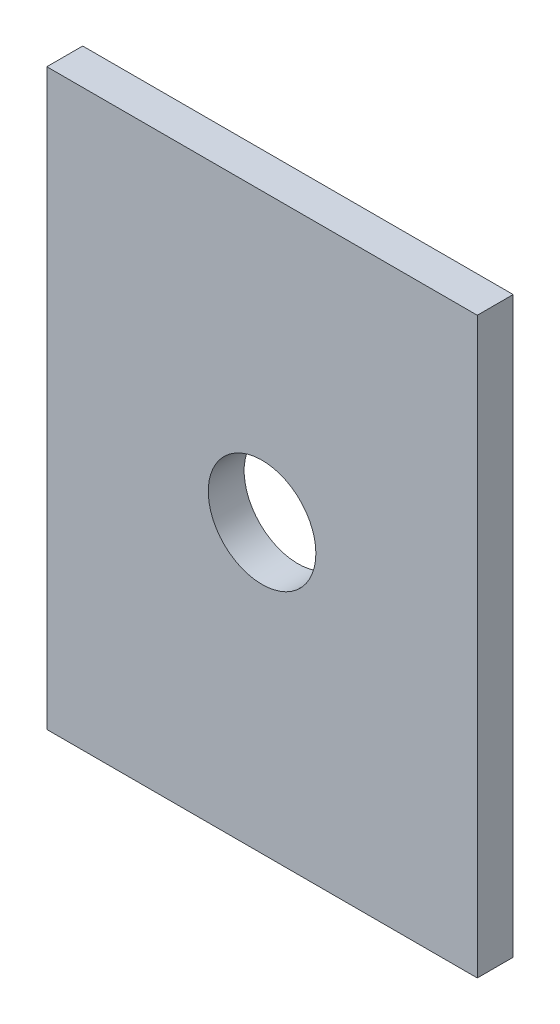
ISO-10303-21;
HEADER;
FILE_DESCRIPTION(('STEP AP214'),'2;1');
FILE_NAME('part.step','',(''),(''),'','','');
FILE_SCHEMA(('AUTOMOTIVE_DESIGN { 1 0 10303 214 1 1 1 1 }'));
ENDSEC;
DATA;
#1=APPLICATION_CONTEXT('core data for automotive mechanical design processes');
#2=APPLICATION_PROTOCOL_DEFINITION('international standard','automotive_design',2000,#1);
#3=PRODUCT_CONTEXT('',#1,'mechanical');
#4=PRODUCT('Part','Part','',(#3));
#5=PRODUCT_RELATED_PRODUCT_CATEGORY('part','',(#4));
#6=PRODUCT_DEFINITION_FORMATION('','',#4);
#7=PRODUCT_DEFINITION_CONTEXT('part definition',#1,'design');
#8=PRODUCT_DEFINITION('design','',#6,#7);
#9=PRODUCT_DEFINITION_SHAPE('','',#8);
#10=(LENGTH_UNIT() NAMED_UNIT(*) SI_UNIT(.MILLI.,.METRE.));
#11=(NAMED_UNIT(*) PLANE_ANGLE_UNIT() SI_UNIT($,.RADIAN.));
#12=(NAMED_UNIT(*) SI_UNIT($,.STERADIAN.) SOLID_ANGLE_UNIT());
#13=UNCERTAINTY_MEASURE_WITH_UNIT(LENGTH_MEASURE(1.E-05),#10,'distance_accuracy_value','');
#14=(GEOMETRIC_REPRESENTATION_CONTEXT(3) GLOBAL_UNCERTAINTY_ASSIGNED_CONTEXT((#13)) GLOBAL_UNIT_ASSIGNED_CONTEXT((#10,
#11,#12)) REPRESENTATION_CONTEXT('',''));
#15=CARTESIAN_POINT('',(0.,0.,0.));
#16=DIRECTION('',(0.,0.,1.));
#17=DIRECTION('',(1.,0.,0.));
#18=AXIS2_PLACEMENT_3D('',#15,#16,#17);
#19=CARTESIAN_POINT('',(0.,0.,3.175));
#20=DIRECTION('',(0.,0.,1.));
#21=DIRECTION('',(1.,0.,0.));
#22=AXIS2_PLACEMENT_3D('',#19,#20,#21);
#23=PLANE('',#22);
#24=DIRECTION('',(0.,1.,0.));
#25=VECTOR('',#24,1.);
#26=CARTESIAN_POINT('',(19.05,25.4,3.175));
#27=LINE('',#26,#25);
#28=CARTESIAN_POINT('',(19.05,-25.4,3.175));
#29=VERTEX_POINT('',#28);
#30=CARTESIAN_POINT('',(19.05,25.4,3.175));
#31=VERTEX_POINT('',#30);
#32=EDGE_CURVE('E96',#29,#31,#27,.T.);
#33=ORIENTED_EDGE('',*,*,#32,.T.);
#34=DIRECTION('',(-1.,0.,0.));
#35=VECTOR('',#34,1.);
#36=CARTESIAN_POINT('',(-19.05,25.4,3.175));
#37=LINE('',#36,#35);
#38=CARTESIAN_POINT('',(-19.05,25.4,3.175));
#39=VERTEX_POINT('',#38);
#40=EDGE_CURVE('E91',#31,#39,#37,.T.);
#41=ORIENTED_EDGE('',*,*,#40,.T.);
#42=DIRECTION('',(0.,-1.,0.));
#43=VECTOR('',#42,1.);
#44=CARTESIAN_POINT('',(-19.05,25.4,3.175));
#45=LINE('',#44,#43);
#46=CARTESIAN_POINT('',(-19.05,-25.4,3.175));
#47=VERTEX_POINT('',#46);
#48=EDGE_CURVE('E94',#39,#47,#45,.T.);
#49=ORIENTED_EDGE('',*,*,#48,.T.);
#50=DIRECTION('',(1.,0.,0.));
#51=VECTOR('',#50,1.);
#52=CARTESIAN_POINT('',(-19.05,-25.4,3.175));
#53=LINE('',#52,#51);
#54=EDGE_CURVE('E61',#47,#29,#53,.T.);
#55=ORIENTED_EDGE('',*,*,#54,.T.);
#56=EDGE_LOOP('',(#33,#41,#49,#55));
#57=FACE_BOUND('',#56,.T.);
#58=CARTESIAN_POINT('',(0.,0.,3.175));
#59=DIRECTION('',(0.,0.,1.));
#60=DIRECTION('',(1.,0.,0.));
#61=AXIS2_PLACEMENT_3D('',#58,#59,#60);
#62=CIRCLE('',#61,4.7625);
#63=CARTESIAN_POINT('',(4.7625,0.,3.175));
#64=VERTEX_POINT('',#63);
#65=EDGE_CURVE('E116',#64,#64,#62,.T.);
#66=ORIENTED_EDGE('',*,*,#65,.F.);
#67=EDGE_LOOP('',(#66));
#68=FACE_BOUND('',#67,.T.);
#69=ADVANCED_FACE('F43',(#57,#68),#23,.T.);
#70=CARTESIAN_POINT('',(0.,0.,0.));
#71=DIRECTION('',(0.,0.,1.));
#72=DIRECTION('',(1.,0.,0.));
#73=AXIS2_PLACEMENT_3D('',#70,#71,#72);
#74=PLANE('',#73);
#75=DIRECTION('',(0.,1.,0.));
#76=VECTOR('',#75,1.);
#77=CARTESIAN_POINT('',(19.05,25.4,0.));
#78=LINE('',#77,#76);
#79=CARTESIAN_POINT('',(19.05,-25.4,0.));
#80=VERTEX_POINT('',#79);
#81=CARTESIAN_POINT('',(19.05,25.4,0.));
#82=VERTEX_POINT('',#81);
#83=EDGE_CURVE('E112',#80,#82,#78,.T.);
#84=ORIENTED_EDGE('',*,*,#83,.F.);
#85=DIRECTION('',(1.,0.,0.));
#86=VECTOR('',#85,1.);
#87=CARTESIAN_POINT('',(-19.05,-25.4,0.));
#88=LINE('',#87,#86);
#89=CARTESIAN_POINT('',(-19.05,-25.4,0.));
#90=VERTEX_POINT('',#89);
#91=EDGE_CURVE('E84',#90,#80,#88,.T.);
#92=ORIENTED_EDGE('',*,*,#91,.F.);
#93=DIRECTION('',(0.,-1.,0.));
#94=VECTOR('',#93,1.);
#95=CARTESIAN_POINT('',(-19.05,25.4,0.));
#96=LINE('',#95,#94);
#97=CARTESIAN_POINT('',(-19.05,25.4,0.));
#98=VERTEX_POINT('',#97);
#99=EDGE_CURVE('E78',#98,#90,#96,.T.);
#100=ORIENTED_EDGE('',*,*,#99,.F.);
#101=DIRECTION('',(-1.,0.,0.));
#102=VECTOR('',#101,1.);
#103=CARTESIAN_POINT('',(-19.05,25.4,0.));
#104=LINE('',#103,#102);
#105=EDGE_CURVE('E101',#82,#98,#104,.T.);
#106=ORIENTED_EDGE('',*,*,#105,.F.);
#107=EDGE_LOOP('',(#84,#92,#100,#106));
#108=FACE_BOUND('',#107,.T.);
#109=CARTESIAN_POINT('',(0.,0.,0.));
#110=DIRECTION('',(0.,0.,1.));
#111=DIRECTION('',(1.,0.,0.));
#112=AXIS2_PLACEMENT_3D('',#109,#110,#111);
#113=CIRCLE('',#112,4.7625);
#114=CARTESIAN_POINT('',(4.7625,0.,0.));
#115=VERTEX_POINT('',#114);
#116=EDGE_CURVE('E134',#115,#115,#113,.T.);
#117=ORIENTED_EDGE('',*,*,#116,.T.);
#118=EDGE_LOOP('',(#117));
#119=FACE_BOUND('',#118,.T.);
#120=ADVANCED_FACE('F129',(#108,#119),#74,.F.);
#121=CARTESIAN_POINT('',(19.05,25.4,3.175));
#122=DIRECTION('',(-1.,0.,0.));
#123=DIRECTION('',(0.,-1.,0.));
#124=AXIS2_PLACEMENT_3D('',#121,#122,#123);
#125=PLANE('',#124);
#126=ORIENTED_EDGE('',*,*,#83,.T.);
#127=DIRECTION('',(0.,0.,-1.));
#128=VECTOR('',#127,1.);
#129=CARTESIAN_POINT('',(19.05,25.4,3.175));
#130=LINE('',#129,#128);
#131=EDGE_CURVE('E11',#31,#82,#130,.T.);
#132=ORIENTED_EDGE('',*,*,#131,.F.);
#133=ORIENTED_EDGE('',*,*,#32,.F.);
#134=DIRECTION('',(0.,0.,-1.));
#135=VECTOR('',#134,1.);
#136=CARTESIAN_POINT('',(19.05,-25.4,3.175));
#137=LINE('',#136,#135);
#138=EDGE_CURVE('E108',#29,#80,#137,.T.);
#139=ORIENTED_EDGE('',*,*,#138,.T.);
#140=EDGE_LOOP('',(#126,#132,#133,#139));
#141=FACE_BOUND('',#140,.T.);
#142=ADVANCED_FACE('F45',(#141),#125,.F.);
#143=CARTESIAN_POINT('',(-19.05,25.4,3.175));
#144=DIRECTION('',(0.,-1.,0.));
#145=DIRECTION('',(0.,0.,-1.));
#146=AXIS2_PLACEMENT_3D('',#143,#144,#145);
#147=PLANE('',#146);
#148=ORIENTED_EDGE('',*,*,#105,.T.);
#149=DIRECTION('',(0.,0.,-1.));
#150=VECTOR('',#149,1.);
#151=CARTESIAN_POINT('',(-19.05,25.4,3.175));
#152=LINE('',#151,#150);
#153=EDGE_CURVE('E53',#39,#98,#152,.T.);
#154=ORIENTED_EDGE('',*,*,#153,.F.);
#155=ORIENTED_EDGE('',*,*,#40,.F.);
#156=ORIENTED_EDGE('',*,*,#131,.T.);
#157=EDGE_LOOP('',(#148,#154,#155,#156));
#158=FACE_BOUND('',#157,.T.);
#159=ADVANCED_FACE('F100',(#158),#147,.F.);
#160=CARTESIAN_POINT('',(-19.05,25.4,3.175));
#161=DIRECTION('',(1.,0.,0.));
#162=DIRECTION('',(0.,1.,0.));
#163=AXIS2_PLACEMENT_3D('',#160,#161,#162);
#164=PLANE('',#163);
#165=ORIENTED_EDGE('',*,*,#99,.T.);
#166=DIRECTION('',(0.,0.,-1.));
#167=VECTOR('',#166,1.);
#168=CARTESIAN_POINT('',(-19.05,-25.4,3.175));
#169=LINE('',#168,#167);
#170=EDGE_CURVE('E103',#47,#90,#169,.T.);
#171=ORIENTED_EDGE('',*,*,#170,.F.);
#172=ORIENTED_EDGE('',*,*,#48,.F.);
#173=ORIENTED_EDGE('',*,*,#153,.T.);
#174=EDGE_LOOP('',(#165,#171,#172,#173));
#175=FACE_BOUND('',#174,.T.);
#176=ADVANCED_FACE('F104',(#175),#164,.F.);
#177=CARTESIAN_POINT('',(-19.05,-25.4,3.175));
#178=DIRECTION('',(0.,1.,0.));
#179=DIRECTION('',(0.,0.,1.));
#180=AXIS2_PLACEMENT_3D('',#177,#178,#179);
#181=PLANE('',#180);
#182=ORIENTED_EDGE('',*,*,#91,.T.);
#183=ORIENTED_EDGE('',*,*,#138,.F.);
#184=ORIENTED_EDGE('',*,*,#54,.F.);
#185=ORIENTED_EDGE('',*,*,#170,.T.);
#186=EDGE_LOOP('',(#182,#183,#184,#185));
#187=FACE_BOUND('',#186,.T.);
#188=ADVANCED_FACE('F126',(#187),#181,.F.);
#189=CARTESIAN_POINT('',(0.,0.,3.175));
#190=DIRECTION('',(0.,0.,-1.));
#191=DIRECTION('',(-1.,0.,0.));
#192=AXIS2_PLACEMENT_3D('',#189,#190,#191);
#193=CYLINDRICAL_SURFACE('',#192,4.7625);
#194=ORIENTED_EDGE('',*,*,#65,.T.);
#195=EDGE_LOOP('',(#194));
#196=FACE_BOUND('',#195,.T.);
#197=ORIENTED_EDGE('',*,*,#116,.F.);
#198=EDGE_LOOP('',(#197));
#199=FACE_BOUND('',#198,.T.);
#200=ADVANCED_FACE('F142',(#196,#199),#193,.F.);
#201=CLOSED_SHELL('',(#69,#120,#142,#159,#176,#188,#200));
#202=MANIFOLD_SOLID_BREP('B2',#201);
#203=ADVANCED_BREP_SHAPE_REPRESENTATION('',(#18,#202),#14);
#204=SHAPE_DEFINITION_REPRESENTATION(#9,#203);
ENDSEC;
END-ISO-10303-21;
